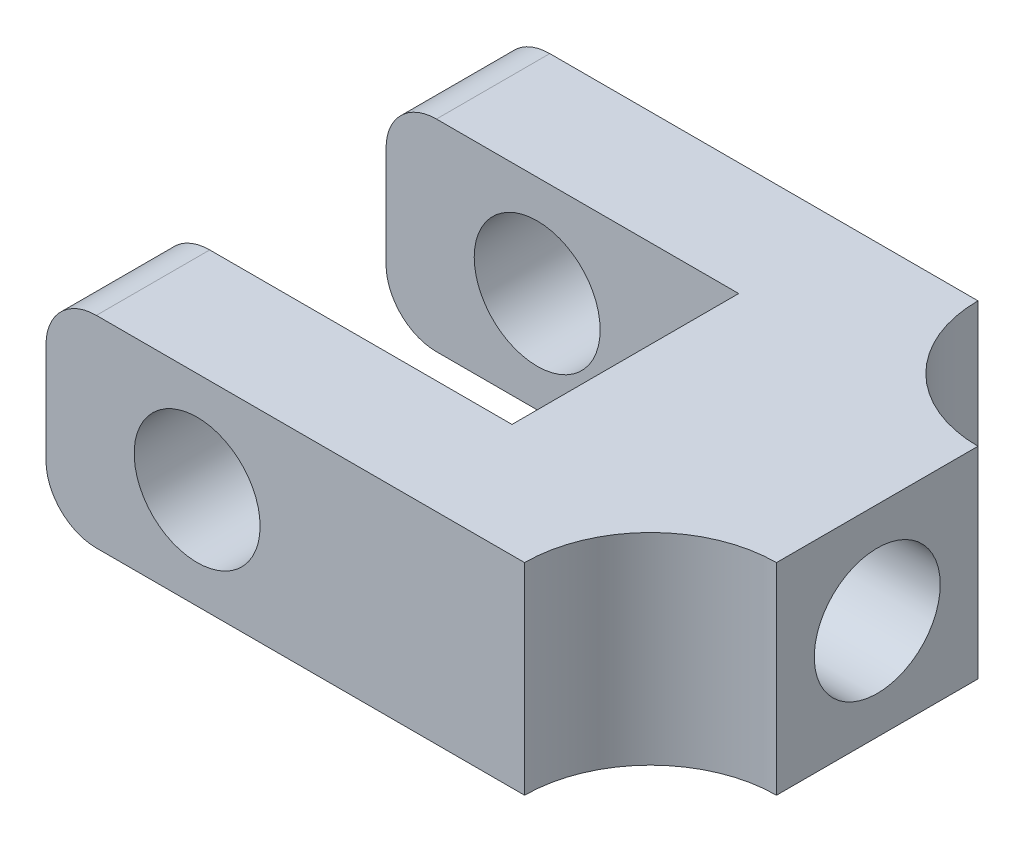
ISO-10303-21;
HEADER;
FILE_DESCRIPTION(('STEP AP214'),'2;1');
FILE_NAME('part.step','',(''),(''),'','','');
FILE_SCHEMA(('AUTOMOTIVE_DESIGN { 1 0 10303 214 1 1 1 1 }'));
ENDSEC;
DATA;
#1=APPLICATION_CONTEXT('core data for automotive mechanical design processes');
#2=APPLICATION_PROTOCOL_DEFINITION('international standard','automotive_design',2000,#1);
#3=PRODUCT_CONTEXT('',#1,'mechanical');
#4=PRODUCT('Part','Part','',(#3));
#5=PRODUCT_RELATED_PRODUCT_CATEGORY('part','',(#4));
#6=PRODUCT_DEFINITION_FORMATION('','',#4);
#7=PRODUCT_DEFINITION_CONTEXT('part definition',#1,'design');
#8=PRODUCT_DEFINITION('design','',#6,#7);
#9=PRODUCT_DEFINITION_SHAPE('','',#8);
#10=(LENGTH_UNIT() NAMED_UNIT(*) SI_UNIT(.MILLI.,.METRE.));
#11=(NAMED_UNIT(*) PLANE_ANGLE_UNIT() SI_UNIT($,.RADIAN.));
#12=(NAMED_UNIT(*) SI_UNIT($,.STERADIAN.) SOLID_ANGLE_UNIT());
#13=UNCERTAINTY_MEASURE_WITH_UNIT(LENGTH_MEASURE(1.E-05),#10,'distance_accuracy_value','');
#14=(GEOMETRIC_REPRESENTATION_CONTEXT(3) GLOBAL_UNCERTAINTY_ASSIGNED_CONTEXT((#13)) GLOBAL_UNIT_ASSIGNED_CONTEXT((#10,
#11,#12)) REPRESENTATION_CONTEXT('',''));
#15=CARTESIAN_POINT('',(0.,0.,0.));
#16=DIRECTION('',(0.,0.,1.));
#17=DIRECTION('',(1.,0.,0.));
#18=AXIS2_PLACEMENT_3D('',#15,#16,#17);
#19=CARTESIAN_POINT('',(0.,4.,4.5));
#20=DIRECTION('',(1.,0.,0.));
#21=DIRECTION('',(0.,0.,-1.));
#22=AXIS2_PLACEMENT_3D('',#19,#20,#21);
#23=PLANE('',#22);
#24=CARTESIAN_POINT('',(0.,0.,0.));
#25=DIRECTION('',(1.,0.,0.));
#26=DIRECTION('',(0.,0.,-1.));
#27=AXIS2_PLACEMENT_3D('',#24,#25,#26);
#28=CIRCLE('',#27,2.5);
#29=CARTESIAN_POINT('',(0.,0.,-2.5));
#30=VERTEX_POINT('',#29);
#31=EDGE_CURVE('E239',#30,#30,#28,.T.);
#32=ORIENTED_EDGE('',*,*,#31,.T.);
#33=EDGE_LOOP('',(#32));
#34=FACE_BOUND('',#33,.T.);
#35=DIRECTION('',(0.,0.,1.));
#36=VECTOR('',#35,1.);
#37=CARTESIAN_POINT('',(0.,-4.,4.5));
#38=LINE('',#37,#36);
#39=CARTESIAN_POINT('',(0.,-4.,-4.5));
#40=VERTEX_POINT('',#39);
#41=CARTESIAN_POINT('',(0.,-4.,4.5));
#42=VERTEX_POINT('',#41);
#43=EDGE_CURVE('E162',#40,#42,#38,.T.);
#44=ORIENTED_EDGE('',*,*,#43,.T.);
#45=DIRECTION('',(0.,-1.,0.));
#46=VECTOR('',#45,1.);
#47=CARTESIAN_POINT('',(0.,4.,4.5));
#48=LINE('',#47,#46);
#49=CARTESIAN_POINT('',(0.,4.,4.5));
#50=VERTEX_POINT('',#49);
#51=EDGE_CURVE('E141',#50,#42,#48,.T.);
#52=ORIENTED_EDGE('',*,*,#51,.F.);
#53=DIRECTION('',(0.,0.,1.));
#54=VECTOR('',#53,1.);
#55=CARTESIAN_POINT('',(0.,4.,4.5));
#56=LINE('',#55,#54);
#57=CARTESIAN_POINT('',(0.,4.,-4.5));
#58=VERTEX_POINT('',#57);
#59=EDGE_CURVE('E148',#58,#50,#56,.T.);
#60=ORIENTED_EDGE('',*,*,#59,.F.);
#61=DIRECTION('',(0.,-1.,0.));
#62=VECTOR('',#61,1.);
#63=CARTESIAN_POINT('',(0.,4.,-4.5));
#64=LINE('',#63,#62);
#65=EDGE_CURVE('E237',#58,#40,#64,.T.);
#66=ORIENTED_EDGE('',*,*,#65,.T.);
#67=EDGE_LOOP('',(#44,#52,#60,#66));
#68=FACE_BOUND('',#67,.T.);
#69=ADVANCED_FACE('F37',(#34,#68),#23,.F.);
#70=CARTESIAN_POINT('',(0.,4.,4.5));
#71=DIRECTION('',(0.,0.,1.));
#72=DIRECTION('',(1.,0.,0.));
#73=AXIS2_PLACEMENT_3D('',#70,#71,#72);
#74=PLANE('',#73);
#75=CARTESIAN_POINT('',(-8.,0.,4.5));
#76=DIRECTION('',(0.,0.,1.));
#77=DIRECTION('',(1.,0.,0.));
#78=AXIS2_PLACEMENT_3D('',#75,#76,#77);
#79=CIRCLE('',#78,2.5);
#80=CARTESIAN_POINT('',(-5.5,0.,4.5));
#81=VERTEX_POINT('',#80);
#82=EDGE_CURVE('E174',#81,#81,#79,.T.);
#83=ORIENTED_EDGE('',*,*,#82,.T.);
#84=EDGE_LOOP('',(#83));
#85=FACE_BOUND('',#84,.T.);
#86=DIRECTION('',(-1.,0.,0.));
#87=VECTOR('',#86,1.);
#88=CARTESIAN_POINT('',(0.,-4.,4.5));
#89=LINE('',#88,#87);
#90=CARTESIAN_POINT('',(-12.,-4.,4.5));
#91=VERTEX_POINT('',#90);
#92=EDGE_CURVE('E218',#42,#91,#89,.T.);
#93=ORIENTED_EDGE('',*,*,#92,.T.);
#94=CARTESIAN_POINT('',(-12.,-2.,4.5));
#95=DIRECTION('',(0.,0.,1.));
#96=DIRECTION('',(1.,0.,0.));
#97=AXIS2_PLACEMENT_3D('',#94,#95,#96);
#98=CIRCLE('',#97,2.);
#99=CARTESIAN_POINT('',(-14.,-2.,4.5));
#100=VERTEX_POINT('',#99);
#101=EDGE_CURVE('E11',#91,#100,#98,.F.);
#102=ORIENTED_EDGE('',*,*,#101,.T.);
#103=DIRECTION('',(0.,-1.,0.));
#104=VECTOR('',#103,1.);
#105=CARTESIAN_POINT('',(-14.,4.,4.5));
#106=LINE('',#105,#104);
#107=CARTESIAN_POINT('',(-14.,2.,4.5));
#108=VERTEX_POINT('',#107);
#109=EDGE_CURVE('E164',#108,#100,#106,.T.);
#110=ORIENTED_EDGE('',*,*,#109,.F.);
#111=CARTESIAN_POINT('',(-12.,2.,4.5));
#112=DIRECTION('',(0.,0.,1.));
#113=DIRECTION('',(1.,0.,0.));
#114=AXIS2_PLACEMENT_3D('',#111,#112,#113);
#115=CIRCLE('',#114,2.);
#116=CARTESIAN_POINT('',(-12.,4.,4.5));
#117=VERTEX_POINT('',#116);
#118=EDGE_CURVE('E45',#108,#117,#115,.F.);
#119=ORIENTED_EDGE('',*,*,#118,.T.);
#120=DIRECTION('',(-1.,0.,0.));
#121=VECTOR('',#120,1.);
#122=CARTESIAN_POINT('',(0.,4.,4.5));
#123=LINE('',#122,#121);
#124=EDGE_CURVE('E137',#50,#117,#123,.T.);
#125=ORIENTED_EDGE('',*,*,#124,.F.);
#126=ORIENTED_EDGE('',*,*,#51,.T.);
#127=EDGE_LOOP('',(#93,#102,#110,#119,#125,#126));
#128=FACE_BOUND('',#127,.T.);
#129=ADVANCED_FACE('F139',(#85,#128),#74,.F.);
#130=CARTESIAN_POINT('',(-14.,4.,4.5));
#131=DIRECTION('',(1.,0.,0.));
#132=DIRECTION('',(0.,0.,-1.));
#133=AXIS2_PLACEMENT_3D('',#130,#131,#132);
#134=PLANE('',#133);
#135=ORIENTED_EDGE('',*,*,#109,.T.);
#136=DIRECTION('',(0.,0.,1.));
#137=VECTOR('',#136,1.);
#138=CARTESIAN_POINT('',(-14.,-2.,4.5));
#139=LINE('',#138,#137);
#140=CARTESIAN_POINT('',(-14.,-2.,9.));
#141=VERTEX_POINT('',#140);
#142=EDGE_CURVE('E196',#100,#141,#139,.T.);
#143=ORIENTED_EDGE('',*,*,#142,.T.);
#144=DIRECTION('',(0.,-1.,0.));
#145=VECTOR('',#144,1.);
#146=CARTESIAN_POINT('',(-14.,4.,9.));
#147=LINE('',#146,#145);
#148=CARTESIAN_POINT('',(-14.,2.,9.));
#149=VERTEX_POINT('',#148);
#150=EDGE_CURVE('E168',#149,#141,#147,.T.);
#151=ORIENTED_EDGE('',*,*,#150,.F.);
#152=DIRECTION('',(0.,0.,1.));
#153=VECTOR('',#152,1.);
#154=CARTESIAN_POINT('',(-14.,2.,4.5));
#155=LINE('',#154,#153);
#156=EDGE_CURVE('E57',#149,#108,#155,.F.);
#157=ORIENTED_EDGE('',*,*,#156,.T.);
#158=EDGE_LOOP('',(#135,#143,#151,#157));
#159=FACE_BOUND('',#158,.T.);
#160=ADVANCED_FACE('F221',(#159),#134,.F.);
#161=CARTESIAN_POINT('',(-14.,4.,9.));
#162=DIRECTION('',(0.,0.,-1.));
#163=DIRECTION('',(-1.,0.,0.));
#164=AXIS2_PLACEMENT_3D('',#161,#162,#163);
#165=PLANE('',#164);
#166=CARTESIAN_POINT('',(-8.,0.,9.));
#167=DIRECTION('',(0.,0.,1.));
#168=DIRECTION('',(1.,0.,0.));
#169=AXIS2_PLACEMENT_3D('',#166,#167,#168);
#170=CIRCLE('',#169,2.5);
#171=CARTESIAN_POINT('',(-5.5,0.,9.));
#172=VERTEX_POINT('',#171);
#173=EDGE_CURVE('E362',#172,#172,#170,.T.);
#174=ORIENTED_EDGE('',*,*,#173,.F.);
#175=EDGE_LOOP('',(#174));
#176=FACE_BOUND('',#175,.T.);
#177=ORIENTED_EDGE('',*,*,#150,.T.);
#178=CARTESIAN_POINT('',(-12.,-2.,9.));
#179=DIRECTION('',(0.,0.,-1.));
#180=DIRECTION('',(-1.,0.,0.));
#181=AXIS2_PLACEMENT_3D('',#178,#179,#180);
#182=CIRCLE('',#181,2.);
#183=CARTESIAN_POINT('',(-12.,-4.,9.));
#184=VERTEX_POINT('',#183);
#185=EDGE_CURVE('E201',#141,#184,#182,.F.);
#186=ORIENTED_EDGE('',*,*,#185,.T.);
#187=DIRECTION('',(1.,0.,0.));
#188=VECTOR('',#187,1.);
#189=CARTESIAN_POINT('',(-14.,-4.,9.));
#190=LINE('',#189,#188);
#191=CARTESIAN_POINT('',(5.,-4.,9.));
#192=VERTEX_POINT('',#191);
#193=EDGE_CURVE('E207',#184,#192,#190,.T.);
#194=ORIENTED_EDGE('',*,*,#193,.T.);
#195=DIRECTION('',(0.,-1.,0.));
#196=VECTOR('',#195,1.);
#197=CARTESIAN_POINT('',(5.,4.,9.));
#198=LINE('',#197,#196);
#199=CARTESIAN_POINT('',(5.,4.,9.));
#200=VERTEX_POINT('',#199);
#201=EDGE_CURVE('E224',#200,#192,#198,.T.);
#202=ORIENTED_EDGE('',*,*,#201,.F.);
#203=DIRECTION('',(1.,0.,0.));
#204=VECTOR('',#203,1.);
#205=CARTESIAN_POINT('',(-14.,4.,9.));
#206=LINE('',#205,#204);
#207=CARTESIAN_POINT('',(-12.,4.,9.));
#208=VERTEX_POINT('',#207);
#209=EDGE_CURVE('E147',#208,#200,#206,.T.);
#210=ORIENTED_EDGE('',*,*,#209,.F.);
#211=CARTESIAN_POINT('',(-12.,2.,9.));
#212=DIRECTION('',(0.,0.,-1.));
#213=DIRECTION('',(-1.,0.,0.));
#214=AXIS2_PLACEMENT_3D('',#211,#212,#213);
#215=CIRCLE('',#214,2.);
#216=EDGE_CURVE('E199',#208,#149,#215,.F.);
#217=ORIENTED_EDGE('',*,*,#216,.T.);
#218=EDGE_LOOP('',(#177,#186,#194,#202,#210,#217));
#219=FACE_BOUND('',#218,.T.);
#220=ADVANCED_FACE('F205',(#176,#219),#165,.F.);
#221=CARTESIAN_POINT('',(10.,4.,9.));
#222=DIRECTION('',(0.,-1.,0.));
#223=DIRECTION('',(0.,0.,-1.));
#224=AXIS2_PLACEMENT_3D('',#221,#222,#223);
#225=CYLINDRICAL_SURFACE('',#224,5.);
#226=CARTESIAN_POINT('',(10.,-4.,9.));
#227=DIRECTION('',(0.,-1.,0.));
#228=DIRECTION('',(0.,0.,-1.));
#229=AXIS2_PLACEMENT_3D('',#226,#227,#228);
#230=CIRCLE('',#229,5.);
#231=CARTESIAN_POINT('',(10.,-4.,4.));
#232=VERTEX_POINT('',#231);
#233=EDGE_CURVE('E217',#192,#232,#230,.T.);
#234=ORIENTED_EDGE('',*,*,#233,.T.);
#235=DIRECTION('',(0.,-1.,0.));
#236=VECTOR('',#235,1.);
#237=CARTESIAN_POINT('',(10.,4.,4.));
#238=LINE('',#237,#236);
#239=CARTESIAN_POINT('',(10.,4.,4.));
#240=VERTEX_POINT('',#239);
#241=EDGE_CURVE('E263',#240,#232,#238,.T.);
#242=ORIENTED_EDGE('',*,*,#241,.F.);
#243=CARTESIAN_POINT('',(10.,4.,9.));
#244=DIRECTION('',(0.,-1.,0.));
#245=DIRECTION('',(0.,0.,-1.));
#246=AXIS2_PLACEMENT_3D('',#243,#244,#245);
#247=CIRCLE('',#246,5.);
#248=EDGE_CURVE('E226',#200,#240,#247,.T.);
#249=ORIENTED_EDGE('',*,*,#248,.F.);
#250=ORIENTED_EDGE('',*,*,#201,.T.);
#251=EDGE_LOOP('',(#234,#242,#249,#250));
#252=FACE_BOUND('',#251,.T.);
#253=ADVANCED_FACE('F267',(#252),#225,.F.);
#254=CARTESIAN_POINT('',(10.,4.,-4.));
#255=DIRECTION('',(-1.,0.,0.));
#256=DIRECTION('',(0.,0.,1.));
#257=AXIS2_PLACEMENT_3D('',#254,#255,#256);
#258=PLANE('',#257);
#259=CARTESIAN_POINT('',(10.,0.,0.));
#260=DIRECTION('',(1.,0.,0.));
#261=DIRECTION('',(0.,0.,-1.));
#262=AXIS2_PLACEMENT_3D('',#259,#260,#261);
#263=CIRCLE('',#262,2.5);
#264=CARTESIAN_POINT('',(10.,0.,-2.5));
#265=VERTEX_POINT('',#264);
#266=EDGE_CURVE('E353',#265,#265,#263,.T.);
#267=ORIENTED_EDGE('',*,*,#266,.F.);
#268=EDGE_LOOP('',(#267));
#269=FACE_BOUND('',#268,.T.);
#270=DIRECTION('',(0.,0.,-1.));
#271=VECTOR('',#270,1.);
#272=CARTESIAN_POINT('',(10.,-4.,-4.));
#273=LINE('',#272,#271);
#274=CARTESIAN_POINT('',(10.,-4.,-4.));
#275=VERTEX_POINT('',#274);
#276=EDGE_CURVE('E242',#232,#275,#273,.T.);
#277=ORIENTED_EDGE('',*,*,#276,.T.);
#278=DIRECTION('',(0.,-1.,0.));
#279=VECTOR('',#278,1.);
#280=CARTESIAN_POINT('',(10.,4.,-4.));
#281=LINE('',#280,#279);
#282=CARTESIAN_POINT('',(10.,4.,-4.));
#283=VERTEX_POINT('',#282);
#284=EDGE_CURVE('E260',#283,#275,#281,.T.);
#285=ORIENTED_EDGE('',*,*,#284,.F.);
#286=DIRECTION('',(0.,0.,-1.));
#287=VECTOR('',#286,1.);
#288=CARTESIAN_POINT('',(10.,4.,-4.));
#289=LINE('',#288,#287);
#290=EDGE_CURVE('E228',#240,#283,#289,.T.);
#291=ORIENTED_EDGE('',*,*,#290,.F.);
#292=ORIENTED_EDGE('',*,*,#241,.T.);
#293=EDGE_LOOP('',(#277,#285,#291,#292));
#294=FACE_BOUND('',#293,.T.);
#295=ADVANCED_FACE('F274',(#269,#294),#258,.F.);
#296=CARTESIAN_POINT('',(10.,4.,-9.));
#297=DIRECTION('',(0.,-1.,0.));
#298=DIRECTION('',(0.,0.,-1.));
#299=AXIS2_PLACEMENT_3D('',#296,#297,#298);
#300=CYLINDRICAL_SURFACE('',#299,5.);
#301=CARTESIAN_POINT('',(10.,-4.,-9.));
#302=DIRECTION('',(0.,-1.,0.));
#303=DIRECTION('',(0.,0.,1.));
#304=AXIS2_PLACEMENT_3D('',#301,#302,#303);
#305=CIRCLE('',#304,5.);
#306=CARTESIAN_POINT('',(5.,-4.,-9.));
#307=VERTEX_POINT('',#306);
#308=EDGE_CURVE('E244',#275,#307,#305,.T.);
#309=ORIENTED_EDGE('',*,*,#308,.T.);
#310=DIRECTION('',(0.,-1.,0.));
#311=VECTOR('',#310,1.);
#312=CARTESIAN_POINT('',(5.,4.,-9.));
#313=LINE('',#312,#311);
#314=CARTESIAN_POINT('',(5.,4.,-9.));
#315=VERTEX_POINT('',#314);
#316=EDGE_CURVE('E257',#315,#307,#313,.T.);
#317=ORIENTED_EDGE('',*,*,#316,.F.);
#318=CARTESIAN_POINT('',(10.,4.,-9.));
#319=DIRECTION('',(0.,-1.,0.));
#320=DIRECTION('',(0.,0.,1.));
#321=AXIS2_PLACEMENT_3D('',#318,#319,#320);
#322=CIRCLE('',#321,5.);
#323=EDGE_CURVE('E232',#283,#315,#322,.T.);
#324=ORIENTED_EDGE('',*,*,#323,.F.);
#325=ORIENTED_EDGE('',*,*,#284,.T.);
#326=EDGE_LOOP('',(#309,#317,#324,#325));
#327=FACE_BOUND('',#326,.T.);
#328=ADVANCED_FACE('F277',(#327),#300,.F.);
#329=CARTESIAN_POINT('',(-14.,4.,-9.));
#330=DIRECTION('',(0.,0.,1.));
#331=DIRECTION('',(1.,0.,0.));
#332=AXIS2_PLACEMENT_3D('',#329,#330,#331);
#333=PLANE('',#332);
#334=CARTESIAN_POINT('',(-8.,0.,-9.));
#335=DIRECTION('',(0.,0.,1.));
#336=DIRECTION('',(1.,0.,0.));
#337=AXIS2_PLACEMENT_3D('',#334,#335,#336);
#338=CIRCLE('',#337,2.5);
#339=CARTESIAN_POINT('',(-5.5,0.,-9.));
#340=VERTEX_POINT('',#339);
#341=EDGE_CURVE('E175',#340,#340,#338,.T.);
#342=ORIENTED_EDGE('',*,*,#341,.T.);
#343=EDGE_LOOP('',(#342));
#344=FACE_BOUND('',#343,.T.);
#345=DIRECTION('',(-1.,0.,0.));
#346=VECTOR('',#345,1.);
#347=CARTESIAN_POINT('',(-14.,-4.,-9.));
#348=LINE('',#347,#346);
#349=CARTESIAN_POINT('',(-12.,-4.,-9.));
#350=VERTEX_POINT('',#349);
#351=EDGE_CURVE('E246',#307,#350,#348,.T.);
#352=ORIENTED_EDGE('',*,*,#351,.T.);
#353=CARTESIAN_POINT('',(-12.,-2.,-9.));
#354=DIRECTION('',(0.,0.,1.));
#355=DIRECTION('',(1.,0.,0.));
#356=AXIS2_PLACEMENT_3D('',#353,#354,#355);
#357=CIRCLE('',#356,2.);
#358=CARTESIAN_POINT('',(-14.,-2.,-9.));
#359=VERTEX_POINT('',#358);
#360=EDGE_CURVE('E189',#350,#359,#357,.F.);
#361=ORIENTED_EDGE('',*,*,#360,.T.);
#362=DIRECTION('',(0.,-1.,0.));
#363=VECTOR('',#362,1.);
#364=CARTESIAN_POINT('',(-14.,4.,-9.));
#365=LINE('',#364,#363);
#366=CARTESIAN_POINT('',(-14.,2.,-9.));
#367=VERTEX_POINT('',#366);
#368=EDGE_CURVE('E254',#367,#359,#365,.T.);
#369=ORIENTED_EDGE('',*,*,#368,.F.);
#370=CARTESIAN_POINT('',(-12.,2.,-9.));
#371=DIRECTION('',(0.,0.,1.));
#372=DIRECTION('',(1.,0.,0.));
#373=AXIS2_PLACEMENT_3D('',#370,#371,#372);
#374=CIRCLE('',#373,2.);
#375=CARTESIAN_POINT('',(-12.,4.,-9.));
#376=VERTEX_POINT('',#375);
#377=EDGE_CURVE('E187',#367,#376,#374,.F.);
#378=ORIENTED_EDGE('',*,*,#377,.T.);
#379=DIRECTION('',(-1.,0.,0.));
#380=VECTOR('',#379,1.);
#381=CARTESIAN_POINT('',(-14.,4.,-9.));
#382=LINE('',#381,#380);
#383=EDGE_CURVE('E234',#315,#376,#382,.T.);
#384=ORIENTED_EDGE('',*,*,#383,.F.);
#385=ORIENTED_EDGE('',*,*,#316,.T.);
#386=EDGE_LOOP('',(#352,#361,#369,#378,#384,#385));
#387=FACE_BOUND('',#386,.T.);
#388=ADVANCED_FACE('F281',(#344,#387),#333,.F.);
#389=CARTESIAN_POINT('',(-14.,4.,-4.5));
#390=DIRECTION('',(1.,0.,0.));
#391=DIRECTION('',(0.,0.,-1.));
#392=AXIS2_PLACEMENT_3D('',#389,#390,#391);
#393=PLANE('',#392);
#394=ORIENTED_EDGE('',*,*,#368,.T.);
#395=DIRECTION('',(0.,0.,1.));
#396=VECTOR('',#395,1.);
#397=CARTESIAN_POINT('',(-14.,-2.,-4.5));
#398=LINE('',#397,#396);
#399=CARTESIAN_POINT('',(-14.,-2.,-4.5));
#400=VERTEX_POINT('',#399);
#401=EDGE_CURVE('E166',#359,#400,#398,.T.);
#402=ORIENTED_EDGE('',*,*,#401,.T.);
#403=DIRECTION('',(0.,-1.,0.));
#404=VECTOR('',#403,1.);
#405=CARTESIAN_POINT('',(-14.,4.,-4.5));
#406=LINE('',#405,#404);
#407=CARTESIAN_POINT('',(-14.,2.,-4.5));
#408=VERTEX_POINT('',#407);
#409=EDGE_CURVE('E251',#408,#400,#406,.T.);
#410=ORIENTED_EDGE('',*,*,#409,.F.);
#411=DIRECTION('',(0.,0.,1.));
#412=VECTOR('',#411,1.);
#413=CARTESIAN_POINT('',(-14.,2.,-9.));
#414=LINE('',#413,#412);
#415=EDGE_CURVE('E163',#408,#367,#414,.F.);
#416=ORIENTED_EDGE('',*,*,#415,.T.);
#417=EDGE_LOOP('',(#394,#402,#410,#416));
#418=FACE_BOUND('',#417,.T.);
#419=ADVANCED_FACE('F292',(#418),#393,.F.);
#420=CARTESIAN_POINT('',(0.,4.,-4.5));
#421=DIRECTION('',(0.,0.,-1.));
#422=DIRECTION('',(-1.,0.,0.));
#423=AXIS2_PLACEMENT_3D('',#420,#421,#422);
#424=PLANE('',#423);
#425=CARTESIAN_POINT('',(-8.,0.,-4.5));
#426=DIRECTION('',(0.,0.,-1.));
#427=DIRECTION('',(-1.,0.,0.));
#428=AXIS2_PLACEMENT_3D('',#425,#426,#427);
#429=CIRCLE('',#428,2.5);
#430=CARTESIAN_POINT('',(-10.5,0.,-4.5));
#431=VERTEX_POINT('',#430);
#432=EDGE_CURVE('E172',#431,#431,#429,.T.);
#433=ORIENTED_EDGE('',*,*,#432,.T.);
#434=EDGE_LOOP('',(#433));
#435=FACE_BOUND('',#434,.T.);
#436=ORIENTED_EDGE('',*,*,#409,.T.);
#437=CARTESIAN_POINT('',(-12.,-2.,-4.5));
#438=DIRECTION('',(0.,0.,-1.));
#439=DIRECTION('',(-1.,0.,0.));
#440=AXIS2_PLACEMENT_3D('',#437,#438,#439);
#441=CIRCLE('',#440,2.);
#442=CARTESIAN_POINT('',(-12.,-4.,-4.5));
#443=VERTEX_POINT('',#442);
#444=EDGE_CURVE('E181',#400,#443,#441,.F.);
#445=ORIENTED_EDGE('',*,*,#444,.T.);
#446=DIRECTION('',(1.,0.,0.));
#447=VECTOR('',#446,1.);
#448=CARTESIAN_POINT('',(0.,-4.,-4.5));
#449=LINE('',#448,#447);
#450=EDGE_CURVE('E159',#443,#40,#449,.T.);
#451=ORIENTED_EDGE('',*,*,#450,.T.);
#452=ORIENTED_EDGE('',*,*,#65,.F.);
#453=DIRECTION('',(1.,0.,0.));
#454=VECTOR('',#453,1.);
#455=CARTESIAN_POINT('',(0.,4.,-4.5));
#456=LINE('',#455,#454);
#457=CARTESIAN_POINT('',(-12.,4.,-4.5));
#458=VERTEX_POINT('',#457);
#459=EDGE_CURVE('E155',#458,#58,#456,.T.);
#460=ORIENTED_EDGE('',*,*,#459,.F.);
#461=CARTESIAN_POINT('',(-12.,2.,-4.5));
#462=DIRECTION('',(0.,0.,-1.));
#463=DIRECTION('',(-1.,0.,0.));
#464=AXIS2_PLACEMENT_3D('',#461,#462,#463);
#465=CIRCLE('',#464,2.);
#466=EDGE_CURVE('E179',#458,#408,#465,.F.);
#467=ORIENTED_EDGE('',*,*,#466,.T.);
#468=EDGE_LOOP('',(#436,#445,#451,#452,#460,#467));
#469=FACE_BOUND('',#468,.T.);
#470=ADVANCED_FACE('F290',(#435,#469),#424,.F.);
#471=CARTESIAN_POINT('',(10.,4.,-9.));
#472=DIRECTION('',(0.,1.,0.));
#473=DIRECTION('',(0.,0.,1.));
#474=AXIS2_PLACEMENT_3D('',#471,#472,#473);
#475=PLANE('',#474);
#476=ORIENTED_EDGE('',*,*,#383,.T.);
#477=DIRECTION('',(0.,0.,1.));
#478=VECTOR('',#477,1.);
#479=CARTESIAN_POINT('',(-12.,4.,-4.5));
#480=LINE('',#479,#478);
#481=EDGE_CURVE('E193',#376,#458,#480,.T.);
#482=ORIENTED_EDGE('',*,*,#481,.T.);
#483=ORIENTED_EDGE('',*,*,#459,.T.);
#484=ORIENTED_EDGE('',*,*,#59,.T.);
#485=ORIENTED_EDGE('',*,*,#124,.T.);
#486=DIRECTION('',(0.,0.,1.));
#487=VECTOR('',#486,1.);
#488=CARTESIAN_POINT('',(-12.,4.,9.));
#489=LINE('',#488,#487);
#490=EDGE_CURVE('E191',#117,#208,#489,.T.);
#491=ORIENTED_EDGE('',*,*,#490,.T.);
#492=ORIENTED_EDGE('',*,*,#209,.T.);
#493=ORIENTED_EDGE('',*,*,#248,.T.);
#494=ORIENTED_EDGE('',*,*,#290,.T.);
#495=ORIENTED_EDGE('',*,*,#323,.T.);
#496=EDGE_LOOP('',(#476,#482,#483,#484,#485,#491,#492,#493,#494,#495));
#497=FACE_BOUND('',#496,.T.);
#498=ADVANCED_FACE('F152',(#497),#475,.T.);
#499=CARTESIAN_POINT('',(10.,-4.,-9.));
#500=DIRECTION('',(0.,1.,0.));
#501=DIRECTION('',(0.,0.,1.));
#502=AXIS2_PLACEMENT_3D('',#499,#500,#501);
#503=PLANE('',#502);
#504=ORIENTED_EDGE('',*,*,#450,.F.);
#505=DIRECTION('',(0.,0.,1.));
#506=VECTOR('',#505,1.);
#507=CARTESIAN_POINT('',(-12.,-4.,-8.99999999999999));
#508=LINE('',#507,#506);
#509=EDGE_CURVE('E185',#443,#350,#508,.F.);
#510=ORIENTED_EDGE('',*,*,#509,.T.);
#511=ORIENTED_EDGE('',*,*,#351,.F.);
#512=ORIENTED_EDGE('',*,*,#308,.F.);
#513=ORIENTED_EDGE('',*,*,#276,.F.);
#514=ORIENTED_EDGE('',*,*,#233,.F.);
#515=ORIENTED_EDGE('',*,*,#193,.F.);
#516=DIRECTION('',(0.,0.,1.));
#517=VECTOR('',#516,1.);
#518=CARTESIAN_POINT('',(-12.,-4.,-9.00000000000001));
#519=LINE('',#518,#517);
#520=EDGE_CURVE('E183',#184,#91,#519,.F.);
#521=ORIENTED_EDGE('',*,*,#520,.T.);
#522=ORIENTED_EDGE('',*,*,#92,.F.);
#523=ORIENTED_EDGE('',*,*,#43,.F.);
#524=EDGE_LOOP('',(#504,#510,#511,#512,#513,#514,#515,#521,#522,#523));
#525=FACE_BOUND('',#524,.T.);
#526=ADVANCED_FACE('F215',(#525),#503,.F.);
#527=CARTESIAN_POINT('',(-14.,0.,0.));
#528=DIRECTION('',(1.,0.,0.));
#529=DIRECTION('',(0.,0.,-1.));
#530=AXIS2_PLACEMENT_3D('',#527,#528,#529);
#531=CYLINDRICAL_SURFACE('',#530,2.5);
#532=ORIENTED_EDGE('',*,*,#266,.T.);
#533=EDGE_LOOP('',(#532));
#534=FACE_BOUND('',#533,.T.);
#535=ORIENTED_EDGE('',*,*,#31,.F.);
#536=EDGE_LOOP('',(#535));
#537=FACE_BOUND('',#536,.T.);
#538=ADVANCED_FACE('F341',(#534,#537),#531,.F.);
#539=CARTESIAN_POINT('',(-8.,0.,-9.));
#540=DIRECTION('',(0.,0.,1.));
#541=DIRECTION('',(1.,0.,0.));
#542=AXIS2_PLACEMENT_3D('',#539,#540,#541);
#543=CYLINDRICAL_SURFACE('',#542,2.5);
#544=ORIENTED_EDGE('',*,*,#341,.F.);
#545=EDGE_LOOP('',(#544));
#546=FACE_BOUND('',#545,.T.);
#547=ORIENTED_EDGE('',*,*,#432,.F.);
#548=EDGE_LOOP('',(#547));
#549=FACE_BOUND('',#548,.T.);
#550=ADVANCED_FACE('F306',(#546,#549),#543,.F.);
#551=ORIENTED_EDGE('',*,*,#173,.T.);
#552=EDGE_LOOP('',(#551));
#553=FACE_BOUND('',#552,.T.);
#554=ORIENTED_EDGE('',*,*,#82,.F.);
#555=EDGE_LOOP('',(#554));
#556=FACE_BOUND('',#555,.T.);
#557=ADVANCED_FACE('F299',(#553,#556),#543,.F.);
#558=CARTESIAN_POINT('',(-12.,-2.,-4.5));
#559=DIRECTION('',(0.,0.,1.));
#560=DIRECTION('',(1.,0.,0.));
#561=AXIS2_PLACEMENT_3D('',#558,#559,#560);
#562=CYLINDRICAL_SURFACE('',#561,2.);
#563=ORIENTED_EDGE('',*,*,#360,.F.);
#564=ORIENTED_EDGE('',*,*,#509,.F.);
#565=ORIENTED_EDGE('',*,*,#444,.F.);
#566=ORIENTED_EDGE('',*,*,#401,.F.);
#567=EDGE_LOOP('',(#563,#564,#565,#566));
#568=FACE_BOUND('',#567,.T.);
#569=ADVANCED_FACE('F296',(#568),#562,.T.);
#570=CARTESIAN_POINT('',(-12.,2.,-8.99999999999999));
#571=DIRECTION('',(0.,0.,-1.));
#572=DIRECTION('',(-1.,0.,0.));
#573=AXIS2_PLACEMENT_3D('',#570,#571,#572);
#574=CYLINDRICAL_SURFACE('',#573,2.);
#575=ORIENTED_EDGE('',*,*,#377,.F.);
#576=ORIENTED_EDGE('',*,*,#415,.F.);
#577=ORIENTED_EDGE('',*,*,#466,.F.);
#578=ORIENTED_EDGE('',*,*,#481,.F.);
#579=EDGE_LOOP('',(#575,#576,#577,#578));
#580=FACE_BOUND('',#579,.T.);
#581=ADVANCED_FACE('F286',(#580),#574,.T.);
#582=CARTESIAN_POINT('',(-12.,-2.,4.5));
#583=DIRECTION('',(0.,0.,1.));
#584=DIRECTION('',(1.,0.,0.));
#585=AXIS2_PLACEMENT_3D('',#582,#583,#584);
#586=CYLINDRICAL_SURFACE('',#585,2.);
#587=ORIENTED_EDGE('',*,*,#101,.F.);
#588=ORIENTED_EDGE('',*,*,#520,.F.);
#589=ORIENTED_EDGE('',*,*,#185,.F.);
#590=ORIENTED_EDGE('',*,*,#142,.F.);
#591=EDGE_LOOP('',(#587,#588,#589,#590));
#592=FACE_BOUND('',#591,.T.);
#593=ADVANCED_FACE('F220',(#592),#586,.T.);
#594=CARTESIAN_POINT('',(-12.,2.,-9.00000000000001));
#595=DIRECTION('',(0.,0.,-1.));
#596=DIRECTION('',(-1.,0.,0.));
#597=AXIS2_PLACEMENT_3D('',#594,#595,#596);
#598=CYLINDRICAL_SURFACE('',#597,2.);
#599=ORIENTED_EDGE('',*,*,#118,.F.);
#600=ORIENTED_EDGE('',*,*,#156,.F.);
#601=ORIENTED_EDGE('',*,*,#216,.F.);
#602=ORIENTED_EDGE('',*,*,#490,.F.);
#603=EDGE_LOOP('',(#599,#600,#601,#602));
#604=FACE_BOUND('',#603,.T.);
#605=ADVANCED_FACE('F39',(#604),#598,.T.);
#606=CLOSED_SHELL('',(#69,#129,#160,#220,#253,#295,#328,#388,#419,#470,#498,#526,#538,#550,#557,
#569,#581,#593,#605));
#607=MANIFOLD_SOLID_BREP('B2',#606);
#608=ADVANCED_BREP_SHAPE_REPRESENTATION('',(#18,#607),#14);
#609=SHAPE_DEFINITION_REPRESENTATION(#9,#608);
ENDSEC;
END-ISO-10303-21;
